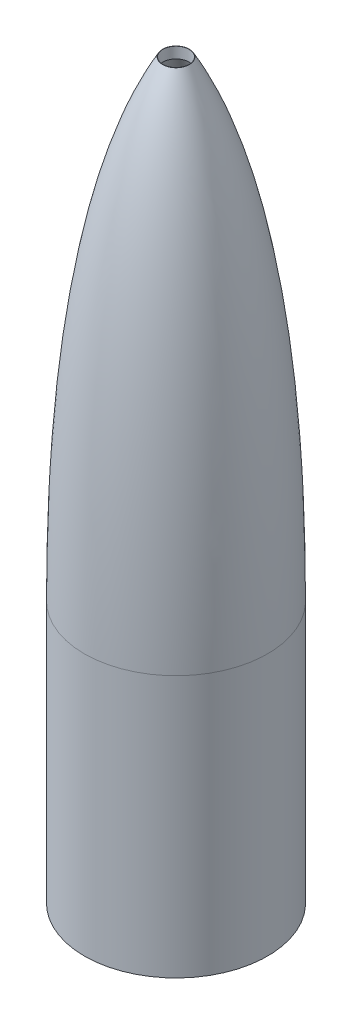
ISO-10303-21;
HEADER;
FILE_DESCRIPTION(('STEP AP214'),'2;1');
FILE_NAME('part.step','',(''),(''),'','','');
FILE_SCHEMA(('AUTOMOTIVE_DESIGN { 1 0 10303 214 1 1 1 1 }'));
ENDSEC;
DATA;
#1=APPLICATION_CONTEXT('core data for automotive mechanical design processes');
#2=APPLICATION_PROTOCOL_DEFINITION('international standard','automotive_design',2000,#1);
#3=PRODUCT_CONTEXT('',#1,'mechanical');
#4=PRODUCT('Part','Part','',(#3));
#5=PRODUCT_RELATED_PRODUCT_CATEGORY('part','',(#4));
#6=PRODUCT_DEFINITION_FORMATION('','',#4);
#7=PRODUCT_DEFINITION_CONTEXT('part definition',#1,'design');
#8=PRODUCT_DEFINITION('design','',#6,#7);
#9=PRODUCT_DEFINITION_SHAPE('','',#8);
#10=(LENGTH_UNIT() NAMED_UNIT(*) SI_UNIT(.MILLI.,.METRE.));
#11=(NAMED_UNIT(*) PLANE_ANGLE_UNIT() SI_UNIT($,.RADIAN.));
#12=(NAMED_UNIT(*) SI_UNIT($,.STERADIAN.) SOLID_ANGLE_UNIT());
#13=UNCERTAINTY_MEASURE_WITH_UNIT(LENGTH_MEASURE(1.E-05),#10,'distance_accuracy_value','');
#14=(GEOMETRIC_REPRESENTATION_CONTEXT(3) GLOBAL_UNCERTAINTY_ASSIGNED_CONTEXT((#13)) GLOBAL_UNIT_ASSIGNED_CONTEXT((#10,
#11,#12)) REPRESENTATION_CONTEXT('',''));
#15=CARTESIAN_POINT('',(0.,0.,0.));
#16=DIRECTION('',(0.,0.,1.));
#17=DIRECTION('',(1.,0.,0.));
#18=AXIS2_PLACEMENT_3D('',#15,#16,#17);
#19=CARTESIAN_POINT('',(0.,15.,0.));
#20=DIRECTION('',(0.,-1.,0.));
#21=DIRECTION('',(0.,0.,-1.));
#22=AXIS2_PLACEMENT_3D('',#19,#20,#21);
#23=CYLINDRICAL_SURFACE('',#22,14.8);
#24=CARTESIAN_POINT('',(0.,5.,0.));
#25=DIRECTION('',(0.,-1.,0.));
#26=DIRECTION('',(0.,0.,-1.));
#27=AXIS2_PLACEMENT_3D('',#24,#25,#26);
#28=CIRCLE('',#27,14.8);
#29=CARTESIAN_POINT('',(14.3554867559411,5.,3.6));
#30=VERTEX_POINT('',#29);
#31=CARTESIAN_POINT('',(14.3554867559411,5.,-3.6));
#32=VERTEX_POINT('',#31);
#33=EDGE_CURVE('E57',#30,#32,#28,.F.);
#34=ORIENTED_EDGE('',*,*,#33,.F.);
#35=DIRECTION('',(0.,-1.,0.));
#36=VECTOR('',#35,1.);
#37=CARTESIAN_POINT('',(14.3554867559411,5.,3.6));
#38=LINE('',#37,#36);
#39=CARTESIAN_POINT('',(14.3554867559411,0.,3.6));
#40=VERTEX_POINT('',#39);
#41=EDGE_CURVE('E122',#30,#40,#38,.T.);
#42=ORIENTED_EDGE('',*,*,#41,.T.);
#43=CARTESIAN_POINT('',(0.,0.,0.));
#44=DIRECTION('',(0.,-1.,0.));
#45=DIRECTION('',(0.,0.,-1.));
#46=AXIS2_PLACEMENT_3D('',#43,#44,#45);
#47=CIRCLE('',#46,14.8);
#48=CARTESIAN_POINT('',(-14.3554867559411,0.,3.6));
#49=VERTEX_POINT('',#48);
#50=EDGE_CURVE('E172',#40,#49,#47,.T.);
#51=ORIENTED_EDGE('',*,*,#50,.T.);
#52=DIRECTION('',(0.,-1.,0.));
#53=VECTOR('',#52,1.);
#54=CARTESIAN_POINT('',(-14.3554867559411,5.,3.6));
#55=LINE('',#54,#53);
#56=CARTESIAN_POINT('',(-14.3554867559411,5.,3.6));
#57=VERTEX_POINT('',#56);
#58=EDGE_CURVE('E158',#57,#49,#55,.T.);
#59=ORIENTED_EDGE('',*,*,#58,.F.);
#60=CARTESIAN_POINT('',(0.,5.,0.));
#61=DIRECTION('',(0.,-1.,0.));
#62=DIRECTION('',(0.,0.,-1.));
#63=AXIS2_PLACEMENT_3D('',#60,#61,#62);
#64=CIRCLE('',#63,14.8);
#65=CARTESIAN_POINT('',(-14.3554867559411,5.,-3.6));
#66=VERTEX_POINT('',#65);
#67=EDGE_CURVE('E150',#66,#57,#64,.F.);
#68=ORIENTED_EDGE('',*,*,#67,.F.);
#69=DIRECTION('',(0.,-1.,0.));
#70=VECTOR('',#69,1.);
#71=CARTESIAN_POINT('',(-14.3554867559411,5.,-3.6));
#72=LINE('',#71,#70);
#73=CARTESIAN_POINT('',(-14.3554867559411,0.,-3.6));
#74=VERTEX_POINT('',#73);
#75=EDGE_CURVE('E175',#66,#74,#72,.T.);
#76=ORIENTED_EDGE('',*,*,#75,.T.);
#77=CARTESIAN_POINT('',(14.3554867559411,0.,-3.6));
#78=VERTEX_POINT('',#77);
#79=EDGE_CURVE('E184',#74,#78,#47,.T.);
#80=ORIENTED_EDGE('',*,*,#79,.T.);
#81=DIRECTION('',(0.,-1.,0.));
#82=VECTOR('',#81,1.);
#83=CARTESIAN_POINT('',(14.3554867559411,5.,-3.6));
#84=LINE('',#83,#82);
#85=EDGE_CURVE('E52',#32,#78,#84,.T.);
#86=ORIENTED_EDGE('',*,*,#85,.F.);
#87=EDGE_LOOP('',(#34,#42,#51,#59,#68,#76,#80,#86));
#88=FACE_BOUND('',#87,.T.);
#89=CARTESIAN_POINT('',(0.,15.,0.));
#90=DIRECTION('',(0.,-1.,0.));
#91=DIRECTION('',(0.,0.,-1.));
#92=AXIS2_PLACEMENT_3D('',#89,#90,#91);
#93=CIRCLE('',#92,14.8);
#94=CARTESIAN_POINT('',(0.,15.,-14.8));
#95=VERTEX_POINT('',#94);
#96=EDGE_CURVE('E180',#95,#95,#93,.T.);
#97=ORIENTED_EDGE('',*,*,#96,.F.);
#98=EDGE_LOOP('',(#97));
#99=FACE_BOUND('',#98,.T.);
#100=ADVANCED_FACE('F35',(#88,#99),#23,.F.);
#101=CARTESIAN_POINT('',(0.,140.001,0.));
#102=DIRECTION('',(0.,-1.,0.));
#103=DIRECTION('',(0.,0.,-1.));
#104=AXIS2_PLACEMENT_3D('',#101,#102,#103);
#105=CYLINDRICAL_SURFACE('',#104,16.3);
#106=CARTESIAN_POINT('',(0.,50.,0.));
#107=DIRECTION('',(0.,-1.,0.));
#108=DIRECTION('',(0.,0.,-1.));
#109=AXIS2_PLACEMENT_3D('',#106,#107,#108);
#110=CIRCLE('',#109,16.3);
#111=CARTESIAN_POINT('',(0.,50.,-16.3));
#112=VERTEX_POINT('',#111);
#113=EDGE_CURVE('E191',#112,#112,#110,.T.);
#114=ORIENTED_EDGE('',*,*,#113,.F.);
#115=EDGE_LOOP('',(#114));
#116=FACE_BOUND('',#115,.T.);
#117=CARTESIAN_POINT('',(0.,15.,0.));
#118=DIRECTION('',(0.,-1.,0.));
#119=DIRECTION('',(0.,0.,-1.));
#120=AXIS2_PLACEMENT_3D('',#117,#118,#119);
#121=CIRCLE('',#120,16.3);
#122=CARTESIAN_POINT('',(0.,15.,-16.3));
#123=VERTEX_POINT('',#122);
#124=EDGE_CURVE('E183',#123,#123,#121,.F.);
#125=ORIENTED_EDGE('',*,*,#124,.F.);
#126=EDGE_LOOP('',(#125));
#127=FACE_BOUND('',#126,.T.);
#128=ADVANCED_FACE('F224',(#116,#127),#105,.F.);
#129=CARTESIAN_POINT('',(-16.3,50.,0.));
#130=CARTESIAN_POINT('',(-16.3,113.627892190343,0.));
#131=CARTESIAN_POINT('',(-2.,138.8,0.));
#132=B_SPLINE_CURVE_WITH_KNOTS('',2,(#129,#130,#131),.UNSPECIFIED.,.F.,.F.,(3,3),(0.,1.),.UNSPECIFIED.);
#133=CARTESIAN_POINT('',(0.,50.,0.));
#134=DIRECTION('',(0.,-1.,0.));
#135=AXIS1_PLACEMENT('',#133,#134);
#136=SURFACE_OF_REVOLUTION('',#132,#135);
#137=CARTESIAN_POINT('',(0.,137.900061640765,0.));
#138=DIRECTION('',(0.,-1.,0.));
#139=DIRECTION('',(0.,0.,-1.));
#140=AXIS2_PLACEMENT_3D('',#137,#138,#139);
#141=CIRCLE('',#140,2.5);
#142=CARTESIAN_POINT('',(0.,137.900061640765,-2.5));
#143=VERTEX_POINT('',#142);
#144=EDGE_CURVE('E188',#143,#143,#141,.F.);
#145=ORIENTED_EDGE('',*,*,#144,.T.);
#146=EDGE_LOOP('',(#145));
#147=FACE_BOUND('',#146,.T.);
#148=ORIENTED_EDGE('',*,*,#113,.T.);
#149=EDGE_LOOP('',(#148));
#150=FACE_BOUND('',#149,.T.);
#151=ADVANCED_FACE('F219',(#147,#150),#136,.T.);
#152=CARTESIAN_POINT('',(0.,50.,0.));
#153=DIRECTION('',(0.,-1.,0.));
#154=DIRECTION('',(0.,0.,-1.));
#155=AXIS2_PLACEMENT_3D('',#152,#153,#154);
#156=CYLINDRICAL_SURFACE('',#155,17.5);
#157=CARTESIAN_POINT('',(0.,50.,0.));
#158=DIRECTION('',(0.,1.,0.));
#159=DIRECTION('',(0.,0.,1.));
#160=AXIS2_PLACEMENT_3D('',#157,#158,#159);
#161=CIRCLE('',#160,17.5);
#162=CARTESIAN_POINT('',(0.,50.,17.5));
#163=VERTEX_POINT('',#162);
#164=EDGE_CURVE('E11',#163,#163,#161,.T.);
#165=ORIENTED_EDGE('',*,*,#164,.F.);
#166=EDGE_LOOP('',(#165));
#167=FACE_BOUND('',#166,.T.);
#168=CARTESIAN_POINT('',(0.,0.,0.));
#169=DIRECTION('',(0.,1.,0.));
#170=DIRECTION('',(0.,0.,1.));
#171=AXIS2_PLACEMENT_3D('',#168,#169,#170);
#172=CIRCLE('',#171,17.5);
#173=CARTESIAN_POINT('',(0.,0.,17.5));
#174=VERTEX_POINT('',#173);
#175=EDGE_CURVE('E44',#174,#174,#172,.T.);
#176=ORIENTED_EDGE('',*,*,#175,.T.);
#177=EDGE_LOOP('',(#176));
#178=FACE_BOUND('',#177,.T.);
#179=ADVANCED_FACE('F37',(#167,#178),#156,.T.);
#180=CARTESIAN_POINT('',(0.,0.,0.));
#181=DIRECTION('',(0.,1.,0.));
#182=DIRECTION('',(0.,0.,1.));
#183=AXIS2_PLACEMENT_3D('',#180,#181,#182);
#184=PLANE('',#183);
#185=ORIENTED_EDGE('',*,*,#175,.F.);
#186=EDGE_LOOP('',(#185));
#187=FACE_BOUND('',#186,.T.);
#188=ORIENTED_EDGE('',*,*,#79,.F.);
#189=DIRECTION('',(1.,0.,0.));
#190=VECTOR('',#189,1.);
#191=CARTESIAN_POINT('',(0.,0.,-3.6));
#192=LINE('',#191,#190);
#193=CARTESIAN_POINT('',(-10.8450704225354,0.,-3.6));
#194=VERTEX_POINT('',#193);
#195=EDGE_CURVE('E164',#74,#194,#192,.T.);
#196=ORIENTED_EDGE('',*,*,#195,.T.);
#197=CARTESIAN_POINT('',(-10.8450704225354,0.,0.));
#198=DIRECTION('',(0.,-1.,0.));
#199=DIRECTION('',(0.,0.,-1.));
#200=AXIS2_PLACEMENT_3D('',#197,#198,#199);
#201=CIRCLE('',#200,3.6);
#202=CARTESIAN_POINT('',(-10.8450704225354,0.,3.6));
#203=VERTEX_POINT('',#202);
#204=EDGE_CURVE('E147',#203,#194,#201,.F.);
#205=ORIENTED_EDGE('',*,*,#204,.F.);
#206=DIRECTION('',(1.,0.,0.));
#207=VECTOR('',#206,1.);
#208=CARTESIAN_POINT('',(0.,0.,3.6));
#209=LINE('',#208,#207);
#210=EDGE_CURVE('E161',#49,#203,#209,.T.);
#211=ORIENTED_EDGE('',*,*,#210,.F.);
#212=ORIENTED_EDGE('',*,*,#50,.F.);
#213=DIRECTION('',(-1.,0.,0.));
#214=VECTOR('',#213,1.);
#215=CARTESIAN_POINT('',(0.,0.,3.6));
#216=LINE('',#215,#214);
#217=CARTESIAN_POINT('',(10.8450704225354,0.,3.6));
#218=VERTEX_POINT('',#217);
#219=EDGE_CURVE('E134',#40,#218,#216,.T.);
#220=ORIENTED_EDGE('',*,*,#219,.T.);
#221=CARTESIAN_POINT('',(10.8450704225354,0.,0.));
#222=DIRECTION('',(0.,-1.,0.));
#223=DIRECTION('',(0.,0.,-1.));
#224=AXIS2_PLACEMENT_3D('',#221,#222,#223);
#225=CIRCLE('',#224,3.6);
#226=CARTESIAN_POINT('',(10.8450704225354,0.,-3.6));
#227=VERTEX_POINT('',#226);
#228=EDGE_CURVE('E107',#218,#227,#225,.T.);
#229=ORIENTED_EDGE('',*,*,#228,.T.);
#230=DIRECTION('',(-1.,0.,0.));
#231=VECTOR('',#230,1.);
#232=CARTESIAN_POINT('',(0.,0.,-3.6));
#233=LINE('',#232,#231);
#234=EDGE_CURVE('E126',#78,#227,#233,.T.);
#235=ORIENTED_EDGE('',*,*,#234,.F.);
#236=EDGE_LOOP('',(#188,#196,#205,#211,#212,#220,#229,#235));
#237=FACE_BOUND('',#236,.T.);
#238=CARTESIAN_POINT('',(-10.8450704225354,0.,0.));
#239=DIRECTION('',(0.,-1.,0.));
#240=DIRECTION('',(0.,0.,-1.));
#241=AXIS2_PLACEMENT_3D('',#238,#239,#240);
#242=CIRCLE('',#241,2.2);
#243=CARTESIAN_POINT('',(-10.8450704225354,0.,-2.2));
#244=VERTEX_POINT('',#243);
#245=EDGE_CURVE('E140',#244,#244,#242,.T.);
#246=ORIENTED_EDGE('',*,*,#245,.F.);
#247=EDGE_LOOP('',(#246));
#248=FACE_BOUND('',#247,.T.);
#249=CARTESIAN_POINT('',(10.8450704225354,0.,0.));
#250=DIRECTION('',(0.,-1.,0.));
#251=DIRECTION('',(0.,0.,-1.));
#252=AXIS2_PLACEMENT_3D('',#249,#250,#251);
#253=CIRCLE('',#252,2.2);
#254=CARTESIAN_POINT('',(10.8450704225354,0.,-2.2));
#255=VERTEX_POINT('',#254);
#256=EDGE_CURVE('E131',#255,#255,#253,.F.);
#257=ORIENTED_EDGE('',*,*,#256,.T.);
#258=EDGE_LOOP('',(#257));
#259=FACE_BOUND('',#258,.T.);
#260=ADVANCED_FACE('F211',(#187,#237,#248,#259),#184,.F.);
#261=CARTESIAN_POINT('',(-2.55,140.,0.));
#262=CARTESIAN_POINT('',(-17.5,113.627892190343,0.));
#263=CARTESIAN_POINT('',(-17.5,50.,0.));
#264=B_SPLINE_CURVE_WITH_KNOTS('',2,(#261,#262,#263),.UNSPECIFIED.,.F.,.F.,(3,3),(0.,1.),.UNSPECIFIED.);
#265=CARTESIAN_POINT('',(0.,50.,0.));
#266=DIRECTION('',(0.,-1.,0.));
#267=AXIS1_PLACEMENT('',#265,#266);
#268=SURFACE_OF_REVOLUTION('',#264,#267);
#269=ORIENTED_EDGE('',*,*,#164,.T.);
#270=EDGE_LOOP('',(#269));
#271=FACE_BOUND('',#270,.T.);
#272=CARTESIAN_POINT('',(0.,140.,0.));
#273=DIRECTION('',(0.,-1.,0.));
#274=DIRECTION('',(0.,0.,-1.));
#275=AXIS2_PLACEMENT_3D('',#272,#273,#274);
#276=CIRCLE('',#275,2.55);
#277=CARTESIAN_POINT('',(0.,140.,-2.55));
#278=VERTEX_POINT('',#277);
#279=EDGE_CURVE('E194',#278,#278,#276,.T.);
#280=ORIENTED_EDGE('',*,*,#279,.T.);
#281=EDGE_LOOP('',(#280));
#282=FACE_BOUND('',#281,.T.);
#283=ADVANCED_FACE('F207',(#271,#282),#268,.T.);
#284=CARTESIAN_POINT('',(0.,140.,0.));
#285=DIRECTION('',(0.,-1.,0.));
#286=DIRECTION('',(0.,0.,-1.));
#287=AXIS2_PLACEMENT_3D('',#284,#285,#286);
#288=PLANE('',#287);
#289=CARTESIAN_POINT('',(0.,140.,0.));
#290=DIRECTION('',(0.,-1.,0.));
#291=DIRECTION('',(0.,0.,-1.));
#292=AXIS2_PLACEMENT_3D('',#289,#290,#291);
#293=CIRCLE('',#292,2.5);
#294=CARTESIAN_POINT('',(0.,140.,-2.5));
#295=VERTEX_POINT('',#294);
#296=EDGE_CURVE('E39',#295,#295,#293,.T.);
#297=ORIENTED_EDGE('',*,*,#296,.T.);
#298=EDGE_LOOP('',(#297));
#299=FACE_BOUND('',#298,.T.);
#300=ORIENTED_EDGE('',*,*,#279,.F.);
#301=EDGE_LOOP('',(#300));
#302=FACE_BOUND('',#301,.T.);
#303=ADVANCED_FACE('F210',(#299,#302),#288,.F.);
#304=CARTESIAN_POINT('',(0.,0.,0.));
#305=DIRECTION('',(0.,1.,0.));
#306=DIRECTION('',(0.,0.,1.));
#307=AXIS2_PLACEMENT_3D('',#304,#305,#306);
#308=CYLINDRICAL_SURFACE('',#307,2.5);
#309=ORIENTED_EDGE('',*,*,#296,.F.);
#310=EDGE_LOOP('',(#309));
#311=FACE_BOUND('',#310,.T.);
#312=ORIENTED_EDGE('',*,*,#144,.F.);
#313=EDGE_LOOP('',(#312));
#314=FACE_BOUND('',#313,.T.);
#315=ADVANCED_FACE('F236',(#311,#314),#308,.F.);
#316=CARTESIAN_POINT('',(0.,15.,0.));
#317=DIRECTION('',(0.,-1.,0.));
#318=DIRECTION('',(0.,0.,-1.));
#319=AXIS2_PLACEMENT_3D('',#316,#317,#318);
#320=PLANE('',#319);
#321=ORIENTED_EDGE('',*,*,#96,.T.);
#322=EDGE_LOOP('',(#321));
#323=FACE_BOUND('',#322,.T.);
#324=ORIENTED_EDGE('',*,*,#124,.T.);
#325=EDGE_LOOP('',(#324));
#326=FACE_BOUND('',#325,.T.);
#327=ADVANCED_FACE('F234',(#323,#326),#320,.F.);
#328=CARTESIAN_POINT('',(0.,5.,3.6));
#329=DIRECTION('',(0.,0.,-1.));
#330=DIRECTION('',(-1.,0.,0.));
#331=AXIS2_PLACEMENT_3D('',#328,#329,#330);
#332=PLANE('',#331);
#333=ORIENTED_EDGE('',*,*,#210,.T.);
#334=DIRECTION('',(0.,-1.,0.));
#335=VECTOR('',#334,1.);
#336=CARTESIAN_POINT('',(-10.8450704225354,5.,3.6));
#337=LINE('',#336,#335);
#338=CARTESIAN_POINT('',(-10.8450704225354,5.,3.6));
#339=VERTEX_POINT('',#338);
#340=EDGE_CURVE('E169',#339,#203,#337,.T.);
#341=ORIENTED_EDGE('',*,*,#340,.F.);
#342=DIRECTION('',(1.,0.,0.));
#343=VECTOR('',#342,1.);
#344=CARTESIAN_POINT('',(0.,5.,3.6));
#345=LINE('',#344,#343);
#346=EDGE_CURVE('E146',#57,#339,#345,.T.);
#347=ORIENTED_EDGE('',*,*,#346,.F.);
#348=ORIENTED_EDGE('',*,*,#58,.T.);
#349=EDGE_LOOP('',(#333,#341,#347,#348));
#350=FACE_BOUND('',#349,.T.);
#351=ADVANCED_FACE('F250',(#350),#332,.F.);
#352=CARTESIAN_POINT('',(-10.8450704225354,5.,0.));
#353=DIRECTION('',(0.,-1.,0.));
#354=DIRECTION('',(0.,0.,-1.));
#355=AXIS2_PLACEMENT_3D('',#352,#353,#354);
#356=CYLINDRICAL_SURFACE('',#355,3.6);
#357=ORIENTED_EDGE('',*,*,#204,.T.);
#358=DIRECTION('',(0.,-1.,0.));
#359=VECTOR('',#358,1.);
#360=CARTESIAN_POINT('',(-10.8450704225354,5.,-3.6));
#361=LINE('',#360,#359);
#362=CARTESIAN_POINT('',(-10.8450704225354,5.,-3.6));
#363=VERTEX_POINT('',#362);
#364=EDGE_CURVE('E173',#363,#194,#361,.T.);
#365=ORIENTED_EDGE('',*,*,#364,.F.);
#366=CARTESIAN_POINT('',(-10.8450704225354,5.,0.));
#367=DIRECTION('',(0.,-1.,0.));
#368=DIRECTION('',(0.,0.,-1.));
#369=AXIS2_PLACEMENT_3D('',#366,#367,#368);
#370=CIRCLE('',#369,3.6);
#371=EDGE_CURVE('E156',#339,#363,#370,.F.);
#372=ORIENTED_EDGE('',*,*,#371,.F.);
#373=ORIENTED_EDGE('',*,*,#340,.T.);
#374=EDGE_LOOP('',(#357,#365,#372,#373));
#375=FACE_BOUND('',#374,.T.);
#376=ADVANCED_FACE('F255',(#375),#356,.T.);
#377=CARTESIAN_POINT('',(0.,5.,-3.6));
#378=DIRECTION('',(0.,0.,-1.));
#379=DIRECTION('',(-1.,0.,0.));
#380=AXIS2_PLACEMENT_3D('',#377,#378,#379);
#381=PLANE('',#380);
#382=ORIENTED_EDGE('',*,*,#195,.F.);
#383=ORIENTED_EDGE('',*,*,#75,.F.);
#384=DIRECTION('',(1.,0.,0.));
#385=VECTOR('',#384,1.);
#386=CARTESIAN_POINT('',(0.,5.,-3.6));
#387=LINE('',#386,#385);
#388=EDGE_CURVE('E153',#66,#363,#387,.T.);
#389=ORIENTED_EDGE('',*,*,#388,.T.);
#390=ORIENTED_EDGE('',*,*,#364,.T.);
#391=EDGE_LOOP('',(#382,#383,#389,#390));
#392=FACE_BOUND('',#391,.T.);
#393=ADVANCED_FACE('F262',(#392),#381,.T.);
#394=CARTESIAN_POINT('',(-10.8450704225354,5.,0.));
#395=DIRECTION('',(0.,-1.,0.));
#396=DIRECTION('',(0.,0.,-1.));
#397=AXIS2_PLACEMENT_3D('',#394,#395,#396);
#398=CYLINDRICAL_SURFACE('',#397,2.2);
#399=CARTESIAN_POINT('',(-10.8450704225354,5.,0.));
#400=DIRECTION('',(0.,-1.,0.));
#401=DIRECTION('',(0.,0.,-1.));
#402=AXIS2_PLACEMENT_3D('',#399,#400,#401);
#403=CIRCLE('',#402,2.2);
#404=CARTESIAN_POINT('',(-10.8450704225354,5.,-2.2));
#405=VERTEX_POINT('',#404);
#406=EDGE_CURVE('E143',#405,#405,#403,.T.);
#407=ORIENTED_EDGE('',*,*,#406,.F.);
#408=EDGE_LOOP('',(#407));
#409=FACE_BOUND('',#408,.T.);
#410=ORIENTED_EDGE('',*,*,#245,.T.);
#411=EDGE_LOOP('',(#410));
#412=FACE_BOUND('',#411,.T.);
#413=ADVANCED_FACE('F266',(#409,#412),#398,.F.);
#414=CARTESIAN_POINT('',(0.,5.,0.));
#415=DIRECTION('',(0.,-1.,0.));
#416=DIRECTION('',(0.,0.,-1.));
#417=AXIS2_PLACEMENT_3D('',#414,#415,#416);
#418=PLANE('',#417);
#419=ORIENTED_EDGE('',*,*,#406,.T.);
#420=EDGE_LOOP('',(#419));
#421=FACE_BOUND('',#420,.T.);
#422=ORIENTED_EDGE('',*,*,#346,.T.);
#423=ORIENTED_EDGE('',*,*,#371,.T.);
#424=ORIENTED_EDGE('',*,*,#388,.F.);
#425=ORIENTED_EDGE('',*,*,#67,.T.);
#426=EDGE_LOOP('',(#422,#423,#424,#425));
#427=FACE_BOUND('',#426,.T.);
#428=ADVANCED_FACE('F268',(#421,#427),#418,.F.);
#429=CARTESIAN_POINT('',(0.,5.,3.6));
#430=DIRECTION('',(0.,0.,1.));
#431=DIRECTION('',(1.,0.,0.));
#432=AXIS2_PLACEMENT_3D('',#429,#430,#431);
#433=PLANE('',#432);
#434=ORIENTED_EDGE('',*,*,#219,.F.);
#435=ORIENTED_EDGE('',*,*,#41,.F.);
#436=DIRECTION('',(-1.,0.,0.));
#437=VECTOR('',#436,1.);
#438=CARTESIAN_POINT('',(0.,5.,3.6));
#439=LINE('',#438,#437);
#440=CARTESIAN_POINT('',(10.8450704225354,5.,3.6));
#441=VERTEX_POINT('',#440);
#442=EDGE_CURVE('E117',#30,#441,#439,.T.);
#443=ORIENTED_EDGE('',*,*,#442,.T.);
#444=DIRECTION('',(0.,-1.,0.));
#445=VECTOR('',#444,1.);
#446=CARTESIAN_POINT('',(10.8450704225354,5.,3.6));
#447=LINE('',#446,#445);
#448=EDGE_CURVE('E102',#441,#218,#447,.T.);
#449=ORIENTED_EDGE('',*,*,#448,.T.);
#450=EDGE_LOOP('',(#434,#435,#443,#449));
#451=FACE_BOUND('',#450,.T.);
#452=ADVANCED_FACE('F121',(#451),#433,.T.);
#453=CARTESIAN_POINT('',(0.,5.,-3.6));
#454=DIRECTION('',(0.,0.,1.));
#455=DIRECTION('',(1.,0.,0.));
#456=AXIS2_PLACEMENT_3D('',#453,#454,#455);
#457=PLANE('',#456);
#458=ORIENTED_EDGE('',*,*,#234,.T.);
#459=DIRECTION('',(0.,-1.,0.));
#460=VECTOR('',#459,1.);
#461=CARTESIAN_POINT('',(10.8450704225354,5.,-3.6));
#462=LINE('',#461,#460);
#463=CARTESIAN_POINT('',(10.8450704225354,5.,-3.6));
#464=VERTEX_POINT('',#463);
#465=EDGE_CURVE('E112',#464,#227,#462,.T.);
#466=ORIENTED_EDGE('',*,*,#465,.F.);
#467=DIRECTION('',(-1.,0.,0.));
#468=VECTOR('',#467,1.);
#469=CARTESIAN_POINT('',(0.,5.,-3.6));
#470=LINE('',#469,#468);
#471=EDGE_CURVE('E118',#32,#464,#470,.T.);
#472=ORIENTED_EDGE('',*,*,#471,.F.);
#473=ORIENTED_EDGE('',*,*,#85,.T.);
#474=EDGE_LOOP('',(#458,#466,#472,#473));
#475=FACE_BOUND('',#474,.T.);
#476=ADVANCED_FACE('F286',(#475),#457,.F.);
#477=CARTESIAN_POINT('',(10.8450704225354,5.,0.));
#478=DIRECTION('',(0.,-1.,0.));
#479=DIRECTION('',(0.,0.,-1.));
#480=AXIS2_PLACEMENT_3D('',#477,#478,#479);
#481=CYLINDRICAL_SURFACE('',#480,2.2);
#482=CARTESIAN_POINT('',(10.8450704225354,5.,0.));
#483=DIRECTION('',(0.,-1.,0.));
#484=DIRECTION('',(0.,0.,-1.));
#485=AXIS2_PLACEMENT_3D('',#482,#483,#484);
#486=CIRCLE('',#485,2.2);
#487=CARTESIAN_POINT('',(10.8450704225354,5.,-2.2));
#488=VERTEX_POINT('',#487);
#489=EDGE_CURVE('E123',#488,#488,#486,.F.);
#490=ORIENTED_EDGE('',*,*,#489,.T.);
#491=EDGE_LOOP('',(#490));
#492=FACE_BOUND('',#491,.T.);
#493=ORIENTED_EDGE('',*,*,#256,.F.);
#494=EDGE_LOOP('',(#493));
#495=FACE_BOUND('',#494,.T.);
#496=ADVANCED_FACE('F284',(#492,#495),#481,.F.);
#497=CARTESIAN_POINT('',(10.8450704225354,5.,0.));
#498=DIRECTION('',(0.,-1.,0.));
#499=DIRECTION('',(0.,0.,-1.));
#500=AXIS2_PLACEMENT_3D('',#497,#498,#499);
#501=CYLINDRICAL_SURFACE('',#500,3.6);
#502=ORIENTED_EDGE('',*,*,#228,.F.);
#503=ORIENTED_EDGE('',*,*,#448,.F.);
#504=CARTESIAN_POINT('',(10.8450704225354,5.,0.));
#505=DIRECTION('',(0.,-1.,0.));
#506=DIRECTION('',(0.,0.,-1.));
#507=AXIS2_PLACEMENT_3D('',#504,#505,#506);
#508=CIRCLE('',#507,3.6);
#509=EDGE_CURVE('E105',#441,#464,#508,.T.);
#510=ORIENTED_EDGE('',*,*,#509,.T.);
#511=ORIENTED_EDGE('',*,*,#465,.T.);
#512=EDGE_LOOP('',(#502,#503,#510,#511));
#513=FACE_BOUND('',#512,.T.);
#514=ADVANCED_FACE('F104',(#513),#501,.T.);
#515=CARTESIAN_POINT('',(0.,5.,0.));
#516=DIRECTION('',(0.,-1.,0.));
#517=DIRECTION('',(0.,0.,-1.));
#518=AXIS2_PLACEMENT_3D('',#515,#516,#517);
#519=PLANE('',#518);
#520=ORIENTED_EDGE('',*,*,#489,.F.);
#521=EDGE_LOOP('',(#520));
#522=FACE_BOUND('',#521,.T.);
#523=ORIENTED_EDGE('',*,*,#442,.F.);
#524=ORIENTED_EDGE('',*,*,#33,.T.);
#525=ORIENTED_EDGE('',*,*,#471,.T.);
#526=ORIENTED_EDGE('',*,*,#509,.F.);
#527=EDGE_LOOP('',(#523,#524,#525,#526));
#528=FACE_BOUND('',#527,.T.);
#529=ADVANCED_FACE('F116',(#522,#528),#519,.F.);
#530=CLOSED_SHELL('',(#100,#128,#151,#179,#260,#283,#303,#315,#327,#351,#376,#393,#413,#428,
#452,#476,#496,#514,#529));
#531=MANIFOLD_SOLID_BREP('B2',#530);
#532=ADVANCED_BREP_SHAPE_REPRESENTATION('',(#18,#531),#14);
#533=SHAPE_DEFINITION_REPRESENTATION(#9,#532);
ENDSEC;
END-ISO-10303-21;
